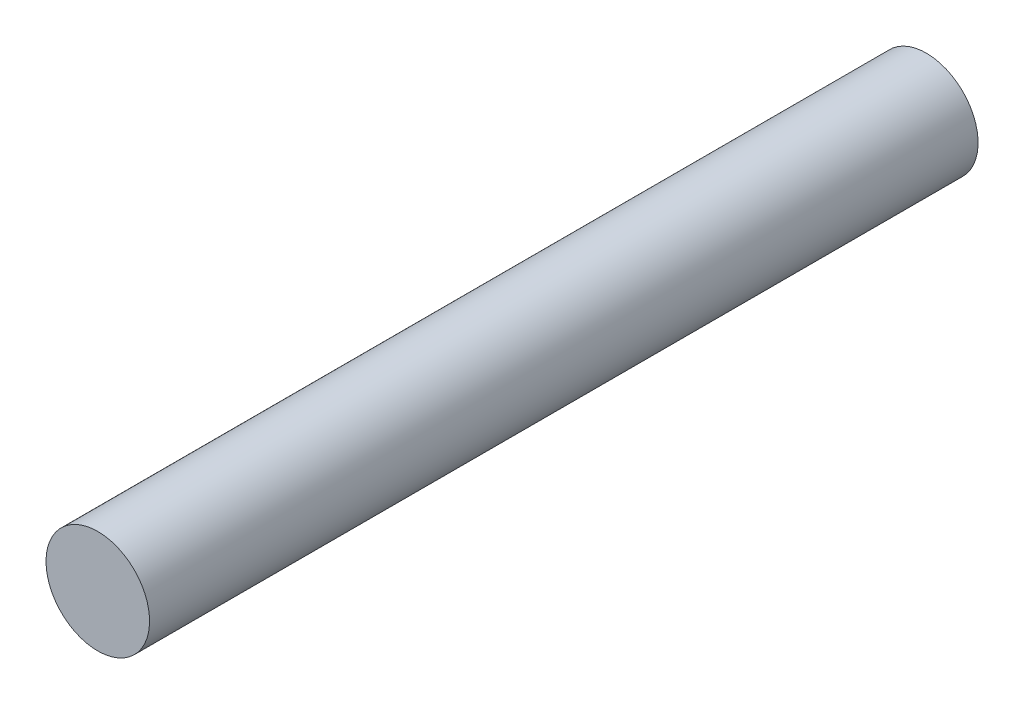
ISO-10303-21;
HEADER;
FILE_DESCRIPTION(('STEP AP214'),'2;1');
FILE_NAME('part.step','',(''),(''),'','','');
FILE_SCHEMA(('AUTOMOTIVE_DESIGN { 1 0 10303 214 1 1 1 1 }'));
ENDSEC;
DATA;
#1=APPLICATION_CONTEXT('core data for automotive mechanical design processes');
#2=APPLICATION_PROTOCOL_DEFINITION('international standard','automotive_design',2000,#1);
#3=PRODUCT_CONTEXT('',#1,'mechanical');
#4=PRODUCT('Part','Part','',(#3));
#5=PRODUCT_RELATED_PRODUCT_CATEGORY('part','',(#4));
#6=PRODUCT_DEFINITION_FORMATION('','',#4);
#7=PRODUCT_DEFINITION_CONTEXT('part definition',#1,'design');
#8=PRODUCT_DEFINITION('design','',#6,#7);
#9=PRODUCT_DEFINITION_SHAPE('','',#8);
#10=(LENGTH_UNIT() NAMED_UNIT(*) SI_UNIT(.MILLI.,.METRE.));
#11=(NAMED_UNIT(*) PLANE_ANGLE_UNIT() SI_UNIT($,.RADIAN.));
#12=(NAMED_UNIT(*) SI_UNIT($,.STERADIAN.) SOLID_ANGLE_UNIT());
#13=UNCERTAINTY_MEASURE_WITH_UNIT(LENGTH_MEASURE(1.E-05),#10,'distance_accuracy_value','');
#14=(GEOMETRIC_REPRESENTATION_CONTEXT(3) GLOBAL_UNCERTAINTY_ASSIGNED_CONTEXT((#13)) GLOBAL_UNIT_ASSIGNED_CONTEXT((#10,
#11,#12)) REPRESENTATION_CONTEXT('',''));
#15=CARTESIAN_POINT('',(0.,0.,0.));
#16=DIRECTION('',(0.,0.,1.));
#17=DIRECTION('',(1.,0.,0.));
#18=AXIS2_PLACEMENT_3D('',#15,#16,#17);
#19=CARTESIAN_POINT('',(0.,4.365625,38.1));
#20=DIRECTION('',(0.,0.,-1.));
#21=DIRECTION('',(-1.,0.,0.));
#22=AXIS2_PLACEMENT_3D('',#19,#20,#21);
#23=CYLINDRICAL_SURFACE('',#22,2.38125);
#24=CARTESIAN_POINT('',(0.,4.365625,38.1));
#25=DIRECTION('',(0.,0.,1.));
#26=DIRECTION('',(1.,0.,0.));
#27=AXIS2_PLACEMENT_3D('',#24,#25,#26);
#28=CIRCLE('',#27,2.38125);
#29=CARTESIAN_POINT('',(-2.38125,4.365625,38.1));
#30=VERTEX_POINT('',#29);
#31=EDGE_CURVE('E10',#30,#30,#28,.T.);
#32=CARTESIAN_POINT('',(0.,4.365625,0.));
#33=DIRECTION('',(0.,0.,1.));
#34=DIRECTION('',(1.,0.,0.));
#35=AXIS2_PLACEMENT_3D('',#32,#33,#34);
#36=CIRCLE('',#35,2.38125);
#37=CARTESIAN_POINT('',(-2.38125,4.365625,0.));
#38=VERTEX_POINT('',#37);
#39=EDGE_CURVE('E33',#38,#38,#36,.T.);
#40=CARTESIAN_POINT('',(-2.38125,4.365625,38.1));
#41=CARTESIAN_POINT('',(-2.38125,4.365625,37.703125));
#42=CARTESIAN_POINT('',(-2.38125,4.365625,37.30625));
#43=CARTESIAN_POINT('',(-2.38125,4.365625,36.5125));
#44=CARTESIAN_POINT('',(-2.38125,4.365625,36.115625));
#45=CARTESIAN_POINT('',(-2.38125,4.365625,35.321875));
#46=CARTESIAN_POINT('',(-2.38125,4.365625,34.925));
#47=CARTESIAN_POINT('',(-2.38125,4.365625,34.13125));
#48=CARTESIAN_POINT('',(-2.38125,4.365625,33.734375));
#49=CARTESIAN_POINT('',(-2.38125,4.365625,32.940625));
#50=CARTESIAN_POINT('',(-2.38125,4.365625,32.54375));
#51=CARTESIAN_POINT('',(-2.38125,4.365625,31.75));
#52=CARTESIAN_POINT('',(-2.38125,4.365625,31.353125));
#53=CARTESIAN_POINT('',(-2.38125,4.365625,30.559375));
#54=CARTESIAN_POINT('',(-2.38125,4.365625,30.1625));
#55=CARTESIAN_POINT('',(-2.38125,4.365625,29.36875));
#56=CARTESIAN_POINT('',(-2.38125,4.365625,28.971875));
#57=CARTESIAN_POINT('',(-2.38125,4.365625,28.178125));
#58=CARTESIAN_POINT('',(-2.38125,4.365625,27.78125));
#59=CARTESIAN_POINT('',(-2.38125,4.365625,26.9875));
#60=CARTESIAN_POINT('',(-2.38125,4.365625,26.590625));
#61=CARTESIAN_POINT('',(-2.38125,4.365625,25.796875));
#62=CARTESIAN_POINT('',(-2.38125,4.365625,25.4));
#63=CARTESIAN_POINT('',(-2.38125,4.365625,24.60625));
#64=CARTESIAN_POINT('',(-2.38125,4.365625,24.209375));
#65=CARTESIAN_POINT('',(-2.38125,4.365625,23.415625));
#66=CARTESIAN_POINT('',(-2.38125,4.365625,23.01875));
#67=CARTESIAN_POINT('',(-2.38125,4.365625,22.225));
#68=CARTESIAN_POINT('',(-2.38125,4.365625,21.828125));
#69=CARTESIAN_POINT('',(-2.38125,4.365625,21.034375));
#70=CARTESIAN_POINT('',(-2.38125,4.365625,20.6375));
#71=CARTESIAN_POINT('',(-2.38125,4.365625,19.84375));
#72=CARTESIAN_POINT('',(-2.38125,4.365625,19.446875));
#73=CARTESIAN_POINT('',(-2.38125,4.365625,18.653125));
#74=CARTESIAN_POINT('',(-2.38125,4.365625,18.25625));
#75=CARTESIAN_POINT('',(-2.38125,4.365625,17.4625));
#76=CARTESIAN_POINT('',(-2.38125,4.365625,17.065625));
#77=CARTESIAN_POINT('',(-2.38125,4.365625,16.271875));
#78=CARTESIAN_POINT('',(-2.38125,4.365625,15.875));
#79=CARTESIAN_POINT('',(-2.38125,4.365625,15.08125));
#80=CARTESIAN_POINT('',(-2.38125,4.365625,14.684375));
#81=CARTESIAN_POINT('',(-2.38125,4.365625,13.890625));
#82=CARTESIAN_POINT('',(-2.38125,4.365625,13.49375));
#83=CARTESIAN_POINT('',(-2.38125,4.365625,12.7));
#84=CARTESIAN_POINT('',(-2.38125,4.365625,12.303125));
#85=CARTESIAN_POINT('',(-2.38125,4.365625,11.509375));
#86=CARTESIAN_POINT('',(-2.38125,4.365625,11.1125));
#87=CARTESIAN_POINT('',(-2.38125,4.365625,10.31875));
#88=CARTESIAN_POINT('',(-2.38125,4.365625,9.92187499999999));
#89=CARTESIAN_POINT('',(-2.38125,4.365625,9.128125));
#90=CARTESIAN_POINT('',(-2.38125,4.365625,8.73124999999999));
#91=CARTESIAN_POINT('',(-2.38125,4.365625,7.93749999999999));
#92=CARTESIAN_POINT('',(-2.38125,4.365625,7.54062499999999));
#93=CARTESIAN_POINT('',(-2.38125,4.365625,6.746875));
#94=CARTESIAN_POINT('',(-2.38125,4.365625,6.35));
#95=CARTESIAN_POINT('',(-2.38125,4.365625,5.55625));
#96=CARTESIAN_POINT('',(-2.38125,4.365625,5.159375));
#97=CARTESIAN_POINT('',(-2.38125,4.365625,4.365625));
#98=CARTESIAN_POINT('',(-2.38125,4.365625,3.96875));
#99=CARTESIAN_POINT('',(-2.38125,4.365625,3.175));
#100=CARTESIAN_POINT('',(-2.38125,4.365625,2.778125));
#101=CARTESIAN_POINT('',(-2.38125,4.365625,1.984375));
#102=CARTESIAN_POINT('',(-2.38125,4.365625,1.5875));
#103=CARTESIAN_POINT('',(-2.38125,4.365625,0.79375));
#104=CARTESIAN_POINT('',(-2.38125,4.365625,0.396875));
#105=CARTESIAN_POINT('',(-2.38125,4.365625,0.));
#106=B_SPLINE_CURVE_WITH_KNOTS('',3,(#40,#41,#42,#43,#44,#45,#46,#47,#48,#49,#50,#51,#52,#53,
#54,#55,#56,#57,#58,#59,#60,#61,#62,#63,#64,#65,#66,#67,#68,#69,#70,#71,#72,#73,#74,#75,#76,#77,
#78,#79,#80,#81,#82,#83,#84,#85,#86,#87,#88,#89,#90,#91,#92,#93,#94,#95,#96,#97,#98,#99,#100,
#101,#102,#103,#104,#105),.UNSPECIFIED.,.F.,.F.,(4,2,2,2,2,2,2,2,2,2,2,2,2,2,2,2,2,2,2,2,2,2,2,
2,2,2,2,2,2,2,2,2,4),(0.,1.190625,2.38125,3.571875,4.7625,5.953125,7.14375,8.334375,
9.52500000000001,10.715625,11.90625,13.096875,14.2875,15.478125,16.66875,17.859375,19.05,
20.240625,21.43125,22.621875,23.8125,25.003125,26.19375,27.384375,28.575,29.765625,30.95625,
32.146875,33.3375,34.528125,35.71875,36.909375,38.1),.UNSPECIFIED.);
#107=EDGE_CURVE('BSEAM30',#30,#38,#106,.T.);
#108=ORIENTED_EDGE('',*,*,#31,.F.);
#109=ORIENTED_EDGE('',*,*,#39,.T.);
#110=ORIENTED_EDGE('',*,*,#107,.T.);
#111=ORIENTED_EDGE('',*,*,#107,.F.);
#112=EDGE_LOOP('',(#108,#110,#109,#111));
#113=FACE_BOUND('',#112,.T.);
#114=ADVANCED_FACE('F30',(#113),#23,.T.);
#115=CARTESIAN_POINT('',(0.,4.365625,38.1));
#116=DIRECTION('',(0.,0.,1.));
#117=DIRECTION('',(1.,0.,0.));
#118=AXIS2_PLACEMENT_3D('',#115,#116,#117);
#119=PLANE('',#118);
#120=ORIENTED_EDGE('',*,*,#31,.T.);
#121=EDGE_LOOP('',(#120));
#122=FACE_BOUND('',#121,.T.);
#123=ADVANCED_FACE('F45',(#122),#119,.T.);
#124=CARTESIAN_POINT('',(0.,4.365625,0.));
#125=DIRECTION('',(0.,0.,1.));
#126=DIRECTION('',(1.,0.,0.));
#127=AXIS2_PLACEMENT_3D('',#124,#125,#126);
#128=PLANE('',#127);
#129=ORIENTED_EDGE('',*,*,#39,.F.);
#130=EDGE_LOOP('',(#129));
#131=FACE_BOUND('',#130,.T.);
#132=ADVANCED_FACE('F43',(#131),#128,.F.);
#133=CLOSED_SHELL('',(#114,#123,#132));
#134=MANIFOLD_SOLID_BREP('B2',#133);
#135=ADVANCED_BREP_SHAPE_REPRESENTATION('',(#18,#134),#14);
#136=SHAPE_DEFINITION_REPRESENTATION(#9,#135);
ENDSEC;
END-ISO-10303-21;
